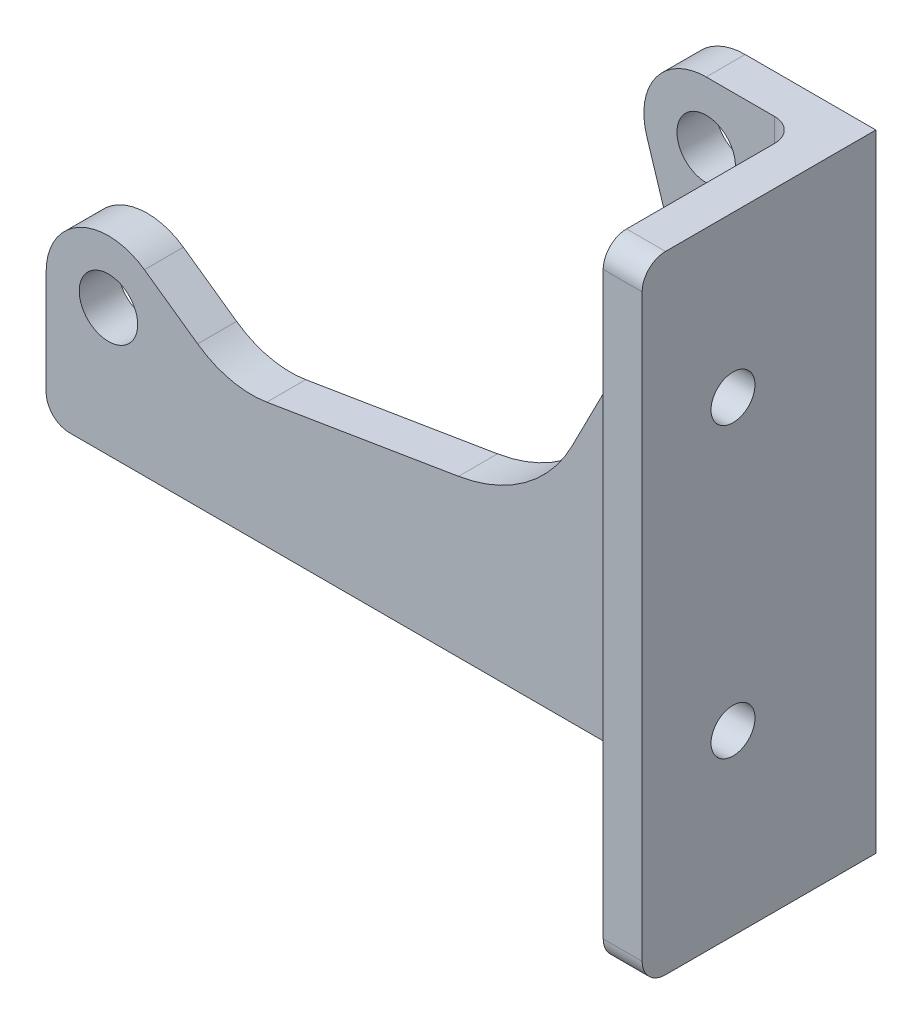
ISO-10303-21;
HEADER;
FILE_DESCRIPTION(('STEP AP214'),'2;1');
FILE_NAME('part.step','',(''),(''),'','','');
FILE_SCHEMA(('AUTOMOTIVE_DESIGN { 1 0 10303 214 1 1 1 1 }'));
ENDSEC;
DATA;
#1=APPLICATION_CONTEXT('core data for automotive mechanical design processes');
#2=APPLICATION_PROTOCOL_DEFINITION('international standard','automotive_design',2000,#1);
#3=PRODUCT_CONTEXT('',#1,'mechanical');
#4=PRODUCT('Part','Part','',(#3));
#5=PRODUCT_RELATED_PRODUCT_CATEGORY('part','',(#4));
#6=PRODUCT_DEFINITION_FORMATION('','',#4);
#7=PRODUCT_DEFINITION_CONTEXT('part definition',#1,'design');
#8=PRODUCT_DEFINITION('design','',#6,#7);
#9=PRODUCT_DEFINITION_SHAPE('','',#8);
#10=(LENGTH_UNIT() NAMED_UNIT(*) SI_UNIT(.MILLI.,.METRE.));
#11=(NAMED_UNIT(*) PLANE_ANGLE_UNIT() SI_UNIT($,.RADIAN.));
#12=(NAMED_UNIT(*) SI_UNIT($,.STERADIAN.) SOLID_ANGLE_UNIT());
#13=UNCERTAINTY_MEASURE_WITH_UNIT(LENGTH_MEASURE(1.E-05),#10,'distance_accuracy_value','');
#14=(GEOMETRIC_REPRESENTATION_CONTEXT(3) GLOBAL_UNCERTAINTY_ASSIGNED_CONTEXT((#13)) GLOBAL_UNIT_ASSIGNED_CONTEXT((#10,
#11,#12)) REPRESENTATION_CONTEXT('',''));
#15=CARTESIAN_POINT('',(0.,0.,0.));
#16=DIRECTION('',(0.,0.,1.));
#17=DIRECTION('',(1.,0.,0.));
#18=AXIS2_PLACEMENT_3D('',#15,#16,#17);
#19=CARTESIAN_POINT('',(0.,0.,6.35));
#20=DIRECTION('',(0.,0.,-1.));
#21=DIRECTION('',(-1.,0.,0.));
#22=AXIS2_PLACEMENT_3D('',#19,#20,#21);
#23=PLANE('',#22);
#24=CARTESIAN_POINT('',(216.357605160255,91.9733247746422,6.35));
#25=DIRECTION('',(0.,0.,-1.));
#26=DIRECTION('',(-1.,0.,0.));
#27=AXIS2_PLACEMENT_3D('',#24,#25,#26);
#28=CIRCLE('',#27,4.76249999997941);
#29=CARTESIAN_POINT('',(211.595105160275,91.9733247746422,6.35));
#30=VERTEX_POINT('',#29);
#31=EDGE_CURVE('E203',#30,#30,#28,.T.);
#32=ORIENTED_EDGE('',*,*,#31,.T.);
#33=EDGE_LOOP('',(#32));
#34=FACE_BOUND('',#33,.T.);
#35=CARTESIAN_POINT('',(118.91249749284,20.8335082744262,6.35));
#36=DIRECTION('',(0.,0.,-1.));
#37=DIRECTION('',(1.,0.,0.));
#38=AXIS2_PLACEMENT_3D('',#35,#36,#37);
#39=CIRCLE('',#38,4.76249999997942);
#40=CARTESIAN_POINT('',(123.674997492819,20.8335082744262,6.35));
#41=VERTEX_POINT('',#40);
#42=EDGE_CURVE('E308',#41,#41,#39,.T.);
#43=ORIENTED_EDGE('',*,*,#42,.T.);
#44=EDGE_LOOP('',(#43));
#45=FACE_BOUND('',#44,.T.);
#46=DIRECTION('',(0.,-1.,0.));
#47=VECTOR('',#46,1.);
#48=CARTESIAN_POINT('',(108.75249749284,20.8335082744262,6.35));
#49=LINE('',#48,#47);
#50=CARTESIAN_POINT('',(108.752497492848,20.8335082744262,6.35));
#51=VERTEX_POINT('',#50);
#52=CARTESIAN_POINT('',(108.75249749284,3.81,6.35));
#53=VERTEX_POINT('',#52);
#54=EDGE_CURVE('E218',#51,#53,#49,.T.);
#55=ORIENTED_EDGE('',*,*,#54,.T.);
#56=CARTESIAN_POINT('',(112.56249749284,3.81,6.35));
#57=DIRECTION('',(0.,0.,-1.));
#58=DIRECTION('',(-1.,0.,0.));
#59=AXIS2_PLACEMENT_3D('',#56,#57,#58);
#60=CIRCLE('',#59,3.81);
#61=CARTESIAN_POINT('',(112.56249749284,0.,6.35));
#62=VERTEX_POINT('',#61);
#63=EDGE_CURVE('E276',#53,#62,#60,.F.);
#64=ORIENTED_EDGE('',*,*,#63,.T.);
#65=DIRECTION('',(1.,0.,0.));
#66=VECTOR('',#65,1.);
#67=CARTESIAN_POINT('',(0.,0.,6.35));
#68=LINE('',#67,#66);
#69=CARTESIAN_POINT('',(227.506601653752,0.,6.35));
#70=VERTEX_POINT('',#69);
#71=EDGE_CURVE('E245',#62,#70,#68,.T.);
#72=ORIENTED_EDGE('',*,*,#71,.T.);
#73=DIRECTION('',(0.,-1.,0.));
#74=VECTOR('',#73,1.);
#75=CARTESIAN_POINT('',(227.506601653752,102.13254705538,6.35));
#76=LINE('',#75,#74);
#77=CARTESIAN_POINT('',(227.506601653752,102.132745141039,6.35));
#78=VERTEX_POINT('',#77);
#79=EDGE_CURVE('E277',#70,#78,#76,.F.);
#80=ORIENTED_EDGE('',*,*,#79,.T.);
#81=DIRECTION('',(-0.999999998648469,5.19909864822466E-05,0.));
#82=VECTOR('',#81,1.);
#83=CARTESIAN_POINT('',(237.666601653752,102.132216912616,6.35));
#84=LINE('',#83,#82);
#85=CARTESIAN_POINT('',(216.358133388677,102.133324760903,6.35));
#86=VERTEX_POINT('',#85);
#87=EDGE_CURVE('E216',#78,#86,#84,.T.);
#88=ORIENTED_EDGE('',*,*,#87,.T.);
#89=CARTESIAN_POINT('',(216.357605160255,91.9733247746422,6.35));
#90=DIRECTION('',(0.,0.,1.));
#91=DIRECTION('',(1.,0.,0.));
#92=AXIS2_PLACEMENT_3D('',#89,#90,#91);
#93=CIRCLE('',#92,10.1599999999881);
#94=CARTESIAN_POINT('',(206.66821837821,88.9169570304559,6.35));
#95=VERTEX_POINT('',#94);
#96=EDGE_CURVE('E214',#86,#95,#93,.T.);
#97=ORIENTED_EDGE('',*,*,#96,.T.);
#98=DIRECTION('',(0.300823596868778,-0.953679801383531,0.));
#99=VECTOR('',#98,1.);
#100=CARTESIAN_POINT('',(206.668218378214,88.9169570304571,6.35));
#101=LINE('',#100,#99);
#102=CARTESIAN_POINT('',(209.86365257402,78.7866976993721,6.35));
#103=VERTEX_POINT('',#102);
#104=EDGE_CURVE('E208',#95,#103,#101,.T.);
#105=ORIENTED_EDGE('',*,*,#104,.T.);
#106=CARTESIAN_POINT('',(195.329572400953,74.2021460830975,6.35));
#107=DIRECTION('',(0.,0.,-1.));
#108=DIRECTION('',(1.,0.,0.));
#109=AXIS2_PLACEMENT_3D('',#106,#107,#108);
#110=CIRCLE('',#109,15.2399999999924);
#111=CARTESIAN_POINT('',(208.895904566196,67.2586432507824,6.35));
#112=VERTEX_POINT('',#111);
#113=EDGE_CURVE('E181',#103,#112,#110,.T.);
#114=ORIENTED_EDGE('',*,*,#113,.T.);
#115=DIRECTION('',(-0.455610422066128,-0.890179275935317,0.));
#116=VECTOR('',#115,1.);
#117=CARTESIAN_POINT('',(208.895904566196,67.2586432507824,6.35));
#118=LINE('',#117,#116);
#119=CARTESIAN_POINT('',(194.461394124829,39.0562549144761,6.35));
#120=VERTEX_POINT('',#119);
#121=EDGE_CURVE('E232',#112,#120,#118,.T.);
#122=ORIENTED_EDGE('',*,*,#121,.T.);
#123=CARTESIAN_POINT('',(171.850840516072,50.6287596349558,6.35));
#124=DIRECTION('',(0.,0.,-1.));
#125=DIRECTION('',(1.,0.,0.));
#126=AXIS2_PLACEMENT_3D('',#123,#124,#125);
#127=CIRCLE('',#126,25.3999999999923);
#128=CARTESIAN_POINT('',(175.984822795608,25.567431048624,6.35));
#129=VERTEX_POINT('',#128);
#130=EDGE_CURVE('E235',#120,#129,#127,.T.);
#131=ORIENTED_EDGE('',*,*,#130,.T.);
#132=DIRECTION('',(-0.986666479777256,-0.1627552078551,0.));
#133=VECTOR('',#132,1.);
#134=CARTESIAN_POINT('',(144.725556293492,20.4110701898963,6.35));
#135=LINE('',#134,#133);
#136=CARTESIAN_POINT('',(144.725556293492,20.4110701898963,6.35));
#137=VERTEX_POINT('',#136);
#138=EDGE_CURVE('E230',#129,#137,#135,.T.);
#139=ORIENTED_EDGE('',*,*,#138,.T.);
#140=CARTESIAN_POINT('',(142.245166925759,35.4478673417011,6.35));
#141=DIRECTION('',(0.,0.,-1.));
#142=DIRECTION('',(1.,0.,0.));
#143=AXIS2_PLACEMENT_3D('',#140,#141,#142);
#144=CIRCLE('',#143,15.2399999999924);
#145=CARTESIAN_POINT('',(133.450682208598,23.0013964137874,6.35));
#146=VERTEX_POINT('',#145);
#147=EDGE_CURVE('E228',#137,#146,#144,.T.);
#148=ORIENTED_EDGE('',*,*,#147,.T.);
#149=DIRECTION('',(-0.816697567448816,0.577065926323143,0.));
#150=VECTOR('',#149,1.);
#151=CARTESIAN_POINT('',(124.775487304277,29.1311555596913,6.35));
#152=LINE('',#151,#150);
#153=CARTESIAN_POINT('',(124.775487304277,29.1311555596913,6.35));
#154=VERTEX_POINT('',#153);
#155=EDGE_CURVE('E225',#146,#154,#152,.T.);
#156=ORIENTED_EDGE('',*,*,#155,.T.);
#157=CARTESIAN_POINT('',(118.91249749284,20.8335082744262,6.35));
#158=DIRECTION('',(0.,0.,1.));
#159=DIRECTION('',(-1.,0.,0.));
#160=AXIS2_PLACEMENT_3D('',#157,#158,#159);
#161=CIRCLE('',#160,10.1599999999921);
#162=EDGE_CURVE('E219',#154,#51,#161,.T.);
#163=ORIENTED_EDGE('',*,*,#162,.T.);
#164=EDGE_LOOP('',(#55,#64,#72,#80,#88,#97,#105,#114,#122,#131,#139,#148,#156,#163));
#165=FACE_BOUND('',#164,.T.);
#166=ADVANCED_FACE('F43',(#34,#45,#165),#23,.F.);
#167=CARTESIAN_POINT('',(0.,0.,6.35));
#168=DIRECTION('',(0.,1.,0.));
#169=DIRECTION('',(0.,0.,1.));
#170=AXIS2_PLACEMENT_3D('',#167,#168,#169);
#171=PLANE('',#170);
#172=DIRECTION('',(0.,0.,-1.));
#173=VECTOR('',#172,1.);
#174=CARTESIAN_POINT('',(237.666601653752,0.,6.35));
#175=LINE('',#174,#173);
#176=CARTESIAN_POINT('',(237.666601653752,0.,34.29));
#177=VERTEX_POINT('',#176);
#178=CARTESIAN_POINT('',(237.666601653752,0.,0.));
#179=VERTEX_POINT('',#178);
#180=EDGE_CURVE('E244',#177,#179,#175,.T.);
#181=ORIENTED_EDGE('',*,*,#180,.F.);
#182=DIRECTION('',(1.,0.,0.));
#183=VECTOR('',#182,1.);
#184=CARTESIAN_POINT('',(231.316601653752,0.,34.29));
#185=LINE('',#184,#183);
#186=CARTESIAN_POINT('',(231.316601653752,0.,34.29));
#187=VERTEX_POINT('',#186);
#188=EDGE_CURVE('E274',#177,#187,#185,.F.);
#189=ORIENTED_EDGE('',*,*,#188,.T.);
#190=DIRECTION('',(0.,0.,-1.));
#191=VECTOR('',#190,1.);
#192=CARTESIAN_POINT('',(231.316601653752,0.,38.1));
#193=LINE('',#192,#191);
#194=CARTESIAN_POINT('',(231.316601653752,0.,10.16));
#195=VERTEX_POINT('',#194);
#196=EDGE_CURVE('E290',#187,#195,#193,.T.);
#197=ORIENTED_EDGE('',*,*,#196,.T.);
#198=CARTESIAN_POINT('',(227.506601653752,0.,10.16));
#199=DIRECTION('',(0.,1.,0.));
#200=DIRECTION('',(0.,0.,1.));
#201=AXIS2_PLACEMENT_3D('',#198,#199,#200);
#202=CIRCLE('',#201,3.81);
#203=EDGE_CURVE('E51',#195,#70,#202,.T.);
#204=ORIENTED_EDGE('',*,*,#203,.T.);
#205=ORIENTED_EDGE('',*,*,#71,.F.);
#206=DIRECTION('',(0.,0.,-1.));
#207=VECTOR('',#206,1.);
#208=CARTESIAN_POINT('',(112.56249749284,0.,6.35));
#209=LINE('',#208,#207);
#210=CARTESIAN_POINT('',(112.56249749284,0.,0.));
#211=VERTEX_POINT('',#210);
#212=EDGE_CURVE('E272',#62,#211,#209,.T.);
#213=ORIENTED_EDGE('',*,*,#212,.T.);
#214=DIRECTION('',(1.,0.,0.));
#215=VECTOR('',#214,1.);
#216=CARTESIAN_POINT('',(0.,0.,0.));
#217=LINE('',#216,#215);
#218=EDGE_CURVE('E239',#211,#179,#217,.T.);
#219=ORIENTED_EDGE('',*,*,#218,.T.);
#220=EDGE_LOOP('',(#181,#189,#197,#204,#205,#213,#219));
#221=FACE_BOUND('',#220,.T.);
#222=ADVANCED_FACE('F284',(#221),#171,.F.);
#223=CARTESIAN_POINT('',(237.666601653752,0.,6.35));
#224=DIRECTION('',(-1.,0.,0.));
#225=DIRECTION('',(0.,0.,1.));
#226=AXIS2_PLACEMENT_3D('',#223,#224,#225);
#227=PLANE('',#226);
#228=CARTESIAN_POINT('',(237.666601653752,76.0306449401721,23.2890629987538));
#229=DIRECTION('',(-1.,0.,0.));
#230=DIRECTION('',(0.,0.,1.));
#231=AXIS2_PLACEMENT_3D('',#228,#229,#230);
#232=CIRCLE('',#231,3.5814);
#233=CARTESIAN_POINT('',(237.666601653752,76.0306449401721,26.8704629987538));
#234=VERTEX_POINT('',#233);
#235=EDGE_CURVE('E424',#234,#234,#232,.T.);
#236=ORIENTED_EDGE('',*,*,#235,.T.);
#237=EDGE_LOOP('',(#236));
#238=FACE_BOUND('',#237,.T.);
#239=CARTESIAN_POINT('',(237.666601653752,28.9822631420205,23.2890629987538));
#240=DIRECTION('',(-1.,0.,0.));
#241=DIRECTION('',(0.,0.,1.));
#242=AXIS2_PLACEMENT_3D('',#239,#240,#241);
#243=CIRCLE('',#242,3.5814);
#244=CARTESIAN_POINT('',(237.666601653752,28.9822631420205,26.8704629987538));
#245=VERTEX_POINT('',#244);
#246=EDGE_CURVE('E427',#245,#245,#243,.T.);
#247=ORIENTED_EDGE('',*,*,#246,.T.);
#248=EDGE_LOOP('',(#247));
#249=FACE_BOUND('',#248,.T.);
#250=DIRECTION('',(0.,0.,-1.));
#251=VECTOR('',#250,1.);
#252=CARTESIAN_POINT('',(237.666601653752,102.132216912616,6.35));
#253=LINE('',#252,#251);
#254=CARTESIAN_POINT('',(237.666601653752,102.132216912616,34.29));
#255=VERTEX_POINT('',#254);
#256=CARTESIAN_POINT('',(237.666601653752,102.132216912616,0.));
#257=VERTEX_POINT('',#256);
#258=EDGE_CURVE('E331',#255,#257,#253,.T.);
#259=ORIENTED_EDGE('',*,*,#258,.F.);
#260=CARTESIAN_POINT('',(237.666601653752,98.3222169074663,34.29));
#261=DIRECTION('',(-1.,0.,0.));
#262=DIRECTION('',(0.,-1.,0.));
#263=AXIS2_PLACEMENT_3D('',#260,#261,#262);
#264=ELLIPSE('',#263,3.81000000514933,3.81);
#265=CARTESIAN_POINT('',(237.666601653752,98.3222169074663,38.1));
#266=VERTEX_POINT('',#265);
#267=EDGE_CURVE('E268',#255,#266,#264,.F.);
#268=ORIENTED_EDGE('',*,*,#267,.T.);
#269=DIRECTION('',(0.,1.,0.));
#270=VECTOR('',#269,1.);
#271=CARTESIAN_POINT('',(237.666601653752,102.132216912616,38.1));
#272=LINE('',#271,#270);
#273=CARTESIAN_POINT('',(237.666601653752,3.80999999999999,38.1));
#274=VERTEX_POINT('',#273);
#275=EDGE_CURVE('E306',#274,#266,#272,.T.);
#276=ORIENTED_EDGE('',*,*,#275,.F.);
#277=CARTESIAN_POINT('',(237.666601653752,3.81,34.29));
#278=DIRECTION('',(-1.,0.,0.));
#279=DIRECTION('',(0.,0.,1.));
#280=AXIS2_PLACEMENT_3D('',#277,#278,#279);
#281=CIRCLE('',#280,3.81);
#282=EDGE_CURVE('E266',#274,#177,#281,.F.);
#283=ORIENTED_EDGE('',*,*,#282,.T.);
#284=ORIENTED_EDGE('',*,*,#180,.T.);
#285=DIRECTION('',(0.,1.,0.));
#286=VECTOR('',#285,1.);
#287=CARTESIAN_POINT('',(237.666601653752,0.,0.));
#288=LINE('',#287,#286);
#289=EDGE_CURVE('E246',#179,#257,#288,.T.);
#290=ORIENTED_EDGE('',*,*,#289,.T.);
#291=EDGE_LOOP('',(#259,#268,#276,#283,#284,#290));
#292=FACE_BOUND('',#291,.T.);
#293=ADVANCED_FACE('F389',(#238,#249,#292),#227,.F.);
#294=CARTESIAN_POINT('',(0.,0.,0.));
#295=DIRECTION('',(0.,0.,-1.));
#296=DIRECTION('',(-1.,0.,0.));
#297=AXIS2_PLACEMENT_3D('',#294,#295,#296);
#298=PLANE('',#297);
#299=ORIENTED_EDGE('',*,*,#218,.F.);
#300=CARTESIAN_POINT('',(112.56249749284,3.81,0.));
#301=DIRECTION('',(0.,0.,-1.));
#302=DIRECTION('',(-1.,0.,0.));
#303=AXIS2_PLACEMENT_3D('',#300,#301,#302);
#304=CIRCLE('',#303,3.81);
#305=CARTESIAN_POINT('',(108.75249749284,3.81,0.));
#306=VERTEX_POINT('',#305);
#307=EDGE_CURVE('E66',#211,#306,#304,.T.);
#308=ORIENTED_EDGE('',*,*,#307,.T.);
#309=DIRECTION('',(0.,-1.,0.));
#310=VECTOR('',#309,1.);
#311=CARTESIAN_POINT('',(108.75249749284,20.8335082744262,0.));
#312=LINE('',#311,#310);
#313=CARTESIAN_POINT('',(108.752497492848,20.8335082744262,0.));
#314=VERTEX_POINT('',#313);
#315=EDGE_CURVE('E343',#314,#306,#312,.T.);
#316=ORIENTED_EDGE('',*,*,#315,.F.);
#317=CARTESIAN_POINT('',(118.91249749284,20.8335082744262,0.));
#318=DIRECTION('',(0.,0.,1.));
#319=DIRECTION('',(-1.,0.,0.));
#320=AXIS2_PLACEMENT_3D('',#317,#318,#319);
#321=CIRCLE('',#320,10.1599999999921);
#322=CARTESIAN_POINT('',(124.775487304277,29.1311555596913,0.));
#323=VERTEX_POINT('',#322);
#324=EDGE_CURVE('E342',#323,#314,#321,.T.);
#325=ORIENTED_EDGE('',*,*,#324,.F.);
#326=DIRECTION('',(-0.816697567448816,0.577065926323143,0.));
#327=VECTOR('',#326,1.);
#328=CARTESIAN_POINT('',(124.775487304277,29.1311555596913,0.));
#329=LINE('',#328,#327);
#330=CARTESIAN_POINT('',(133.450682208598,23.0013964137874,0.));
#331=VERTEX_POINT('',#330);
#332=EDGE_CURVE('E346',#331,#323,#329,.T.);
#333=ORIENTED_EDGE('',*,*,#332,.F.);
#334=CARTESIAN_POINT('',(142.245166925759,35.4478673417011,0.));
#335=DIRECTION('',(0.,0.,-1.));
#336=DIRECTION('',(1.,0.,0.));
#337=AXIS2_PLACEMENT_3D('',#334,#335,#336);
#338=CIRCLE('',#337,15.2399999999924);
#339=CARTESIAN_POINT('',(144.725556293492,20.4110701898963,0.));
#340=VERTEX_POINT('',#339);
#341=EDGE_CURVE('E347',#340,#331,#338,.T.);
#342=ORIENTED_EDGE('',*,*,#341,.F.);
#343=DIRECTION('',(-0.986666479777256,-0.1627552078551,0.));
#344=VECTOR('',#343,1.);
#345=CARTESIAN_POINT('',(144.725556293492,20.4110701898963,0.));
#346=LINE('',#345,#344);
#347=CARTESIAN_POINT('',(175.984822795608,25.567431048624,0.));
#348=VERTEX_POINT('',#347);
#349=EDGE_CURVE('E351',#348,#340,#346,.T.);
#350=ORIENTED_EDGE('',*,*,#349,.F.);
#351=CARTESIAN_POINT('',(171.850840516072,50.6287596349558,0.));
#352=DIRECTION('',(0.,0.,-1.));
#353=DIRECTION('',(1.,0.,0.));
#354=AXIS2_PLACEMENT_3D('',#351,#352,#353);
#355=CIRCLE('',#354,25.3999999999923);
#356=CARTESIAN_POINT('',(194.461394124829,39.0562549144761,0.));
#357=VERTEX_POINT('',#356);
#358=EDGE_CURVE('E207',#357,#348,#355,.T.);
#359=ORIENTED_EDGE('',*,*,#358,.F.);
#360=DIRECTION('',(-0.455610422066128,-0.890179275935317,0.));
#361=VECTOR('',#360,1.);
#362=CARTESIAN_POINT('',(208.895904566196,67.2586432507824,0.));
#363=LINE('',#362,#361);
#364=CARTESIAN_POINT('',(208.895904566196,67.2586432507824,0.));
#365=VERTEX_POINT('',#364);
#366=EDGE_CURVE('E199',#365,#357,#363,.T.);
#367=ORIENTED_EDGE('',*,*,#366,.F.);
#368=CARTESIAN_POINT('',(195.329572400953,74.2021460830975,0.));
#369=DIRECTION('',(0.,0.,-1.));
#370=DIRECTION('',(1.,0.,0.));
#371=AXIS2_PLACEMENT_3D('',#368,#369,#370);
#372=CIRCLE('',#371,15.2399999999924);
#373=CARTESIAN_POINT('',(209.86365257402,78.7866976993721,0.));
#374=VERTEX_POINT('',#373);
#375=EDGE_CURVE('E178',#374,#365,#372,.T.);
#376=ORIENTED_EDGE('',*,*,#375,.F.);
#377=DIRECTION('',(0.300823596868778,-0.953679801383531,0.));
#378=VECTOR('',#377,1.);
#379=CARTESIAN_POINT('',(206.668218378214,88.9169570304571,0.));
#380=LINE('',#379,#378);
#381=CARTESIAN_POINT('',(206.66821837821,88.9169570304559,0.));
#382=VERTEX_POINT('',#381);
#383=EDGE_CURVE('E186',#382,#374,#380,.T.);
#384=ORIENTED_EDGE('',*,*,#383,.F.);
#385=CARTESIAN_POINT('',(216.357605160255,91.9733247746422,0.));
#386=DIRECTION('',(0.,0.,1.));
#387=DIRECTION('',(1.,0.,0.));
#388=AXIS2_PLACEMENT_3D('',#385,#386,#387);
#389=CIRCLE('',#388,10.1599999999881);
#390=CARTESIAN_POINT('',(216.358133388677,102.133324760903,0.));
#391=VERTEX_POINT('',#390);
#392=EDGE_CURVE('E192',#391,#382,#389,.T.);
#393=ORIENTED_EDGE('',*,*,#392,.F.);
#394=DIRECTION('',(-0.999999998648469,5.19909864822466E-05,0.));
#395=VECTOR('',#394,1.);
#396=CARTESIAN_POINT('',(237.666601653752,102.132216912616,0.));
#397=LINE('',#396,#395);
#398=EDGE_CURVE('E336',#257,#391,#397,.T.);
#399=ORIENTED_EDGE('',*,*,#398,.F.);
#400=ORIENTED_EDGE('',*,*,#289,.F.);
#401=EDGE_LOOP('',(#299,#308,#316,#325,#333,#342,#350,#359,#367,#376,#384,#393,#399,#400));
#402=FACE_BOUND('',#401,.T.);
#403=CARTESIAN_POINT('',(118.91249749284,20.8335082744262,0.));
#404=DIRECTION('',(0.,0.,-1.));
#405=DIRECTION('',(1.,0.,0.));
#406=AXIS2_PLACEMENT_3D('',#403,#404,#405);
#407=CIRCLE('',#406,4.76249999997942);
#408=CARTESIAN_POINT('',(123.674997492819,20.8335082744262,0.));
#409=VERTEX_POINT('',#408);
#410=EDGE_CURVE('E187',#409,#409,#407,.T.);
#411=ORIENTED_EDGE('',*,*,#410,.F.);
#412=EDGE_LOOP('',(#411));
#413=FACE_BOUND('',#412,.T.);
#414=CARTESIAN_POINT('',(216.357605160255,91.9733247746422,0.));
#415=DIRECTION('',(0.,0.,-1.));
#416=DIRECTION('',(-1.,0.,0.));
#417=AXIS2_PLACEMENT_3D('',#414,#415,#416);
#418=CIRCLE('',#417,4.76249999997941);
#419=CARTESIAN_POINT('',(211.595105160275,91.9733247746422,0.));
#420=VERTEX_POINT('',#419);
#421=EDGE_CURVE('E204',#420,#420,#418,.T.);
#422=ORIENTED_EDGE('',*,*,#421,.F.);
#423=EDGE_LOOP('',(#422));
#424=FACE_BOUND('',#423,.T.);
#425=ADVANCED_FACE('F196',(#402,#413,#424),#298,.T.);
#426=CARTESIAN_POINT('',(216.357605160255,91.9733247746422,6.35));
#427=DIRECTION('',(0.,0.,-1.));
#428=DIRECTION('',(-1.,0.,0.));
#429=AXIS2_PLACEMENT_3D('',#426,#427,#428);
#430=CYLINDRICAL_SURFACE('',#429,4.76249999997941);
#431=ORIENTED_EDGE('',*,*,#31,.F.);
#432=EDGE_LOOP('',(#431));
#433=FACE_BOUND('',#432,.T.);
#434=ORIENTED_EDGE('',*,*,#421,.T.);
#435=EDGE_LOOP('',(#434));
#436=FACE_BOUND('',#435,.T.);
#437=ADVANCED_FACE('F395',(#433,#436),#430,.F.);
#438=CARTESIAN_POINT('',(118.91249749284,20.8335082744262,6.35));
#439=DIRECTION('',(0.,0.,-1.));
#440=DIRECTION('',(-1.,0.,0.));
#441=AXIS2_PLACEMENT_3D('',#438,#439,#440);
#442=CYLINDRICAL_SURFACE('',#441,4.76249999997942);
#443=ORIENTED_EDGE('',*,*,#42,.F.);
#444=EDGE_LOOP('',(#443));
#445=FACE_BOUND('',#444,.T.);
#446=ORIENTED_EDGE('',*,*,#410,.T.);
#447=EDGE_LOOP('',(#446));
#448=FACE_BOUND('',#447,.T.);
#449=ADVANCED_FACE('F452',(#445,#448),#442,.F.);
#450=CARTESIAN_POINT('',(195.329572400953,74.2021460830975,6.35));
#451=DIRECTION('',(0.,0.,-1.));
#452=DIRECTION('',(-1.,0.,0.));
#453=AXIS2_PLACEMENT_3D('',#450,#451,#452);
#454=CYLINDRICAL_SURFACE('',#453,15.2399999999924);
#455=ORIENTED_EDGE('',*,*,#375,.T.);
#456=DIRECTION('',(0.,0.,-1.));
#457=VECTOR('',#456,1.);
#458=CARTESIAN_POINT('',(208.895904566196,67.2586432507824,6.35));
#459=LINE('',#458,#457);
#460=EDGE_CURVE('E212',#112,#365,#459,.T.);
#461=ORIENTED_EDGE('',*,*,#460,.F.);
#462=ORIENTED_EDGE('',*,*,#113,.F.);
#463=DIRECTION('',(0.,0.,-1.));
#464=VECTOR('',#463,1.);
#465=CARTESIAN_POINT('',(209.86365257402,78.7866976993721,6.35));
#466=LINE('',#465,#464);
#467=EDGE_CURVE('E172',#103,#374,#466,.T.);
#468=ORIENTED_EDGE('',*,*,#467,.T.);
#469=EDGE_LOOP('',(#455,#461,#462,#468));
#470=FACE_BOUND('',#469,.T.);
#471=ADVANCED_FACE('F176',(#470),#454,.F.);
#472=CARTESIAN_POINT('',(206.668218378214,88.9169570304571,6.35));
#473=DIRECTION('',(0.953679801383531,0.300823596868778,0.));
#474=DIRECTION('',(-0.300823596868778,0.953679801383531,0.));
#475=AXIS2_PLACEMENT_3D('',#472,#473,#474);
#476=PLANE('',#475);
#477=ORIENTED_EDGE('',*,*,#383,.T.);
#478=ORIENTED_EDGE('',*,*,#467,.F.);
#479=ORIENTED_EDGE('',*,*,#104,.F.);
#480=DIRECTION('',(0.,0.,-1.));
#481=VECTOR('',#480,1.);
#482=CARTESIAN_POINT('',(206.66821837821,88.9169570304559,6.35));
#483=LINE('',#482,#481);
#484=EDGE_CURVE('E184',#95,#382,#483,.T.);
#485=ORIENTED_EDGE('',*,*,#484,.T.);
#486=EDGE_LOOP('',(#477,#478,#479,#485));
#487=FACE_BOUND('',#486,.T.);
#488=ADVANCED_FACE('F188',(#487),#476,.F.);
#489=CARTESIAN_POINT('',(216.357605160255,91.9733247746422,6.35));
#490=DIRECTION('',(0.,0.,-1.));
#491=DIRECTION('',(-1.,0.,0.));
#492=AXIS2_PLACEMENT_3D('',#489,#490,#491);
#493=CYLINDRICAL_SURFACE('',#492,10.1599999999881);
#494=ORIENTED_EDGE('',*,*,#392,.T.);
#495=ORIENTED_EDGE('',*,*,#484,.F.);
#496=ORIENTED_EDGE('',*,*,#96,.F.);
#497=DIRECTION('',(0.,0.,-1.));
#498=VECTOR('',#497,1.);
#499=CARTESIAN_POINT('',(216.358133388677,102.133324760903,6.35));
#500=LINE('',#499,#498);
#501=EDGE_CURVE('E333',#86,#391,#500,.T.);
#502=ORIENTED_EDGE('',*,*,#501,.T.);
#503=EDGE_LOOP('',(#494,#495,#496,#502));
#504=FACE_BOUND('',#503,.T.);
#505=ADVANCED_FACE('F459',(#504),#493,.T.);
#506=CARTESIAN_POINT('',(237.666601653752,102.132216912616,6.35));
#507=DIRECTION('',(-5.19909864822466E-05,-0.999999998648469,0.));
#508=DIRECTION('',(0.999999998648469,-5.19909864822466E-05,0.));
#509=AXIS2_PLACEMENT_3D('',#506,#507,#508);
#510=PLANE('',#509);
#511=DIRECTION('',(0.,0.,-1.));
#512=VECTOR('',#511,1.);
#513=CARTESIAN_POINT('',(231.316601653752,102.13254705538,38.1));
#514=LINE('',#513,#512);
#515=CARTESIAN_POINT('',(231.316601653752,102.13254705538,34.29));
#516=VERTEX_POINT('',#515);
#517=CARTESIAN_POINT('',(231.316601653752,102.13254705538,10.16));
#518=VERTEX_POINT('',#517);
#519=EDGE_CURVE('E297',#516,#518,#514,.T.);
#520=ORIENTED_EDGE('',*,*,#519,.F.);
#521=DIRECTION('',(-0.999999998648469,5.19909864822466E-05,0.));
#522=VECTOR('',#521,1.);
#523=CARTESIAN_POINT('',(237.666601653752,102.132216912616,34.29));
#524=LINE('',#523,#522);
#525=EDGE_CURVE('E264',#516,#255,#524,.F.);
#526=ORIENTED_EDGE('',*,*,#525,.T.);
#527=ORIENTED_EDGE('',*,*,#258,.T.);
#528=ORIENTED_EDGE('',*,*,#398,.T.);
#529=ORIENTED_EDGE('',*,*,#501,.F.);
#530=ORIENTED_EDGE('',*,*,#87,.F.);
#531=CARTESIAN_POINT('',(227.506601653752,102.132745141039,10.16));
#532=DIRECTION('',(-5.19909864822466E-05,-0.999999998648469,0.));
#533=DIRECTION('',(-0.999999998648469,5.19909864822466E-05,0.));
#534=AXIS2_PLACEMENT_3D('',#531,#532,#533);
#535=ELLIPSE('',#534,3.81000000514933,3.81);
#536=EDGE_CURVE('E11',#78,#518,#535,.T.);
#537=ORIENTED_EDGE('',*,*,#536,.T.);
#538=EDGE_LOOP('',(#520,#526,#527,#528,#529,#530,#537));
#539=FACE_BOUND('',#538,.T.);
#540=ADVANCED_FACE('F299',(#539),#510,.F.);
#541=CARTESIAN_POINT('',(108.75249749284,20.8335082744262,6.35));
#542=DIRECTION('',(1.,0.,0.));
#543=DIRECTION('',(0.,1.,0.));
#544=AXIS2_PLACEMENT_3D('',#541,#542,#543);
#545=PLANE('',#544);
#546=ORIENTED_EDGE('',*,*,#315,.T.);
#547=DIRECTION('',(0.,0.,-1.));
#548=VECTOR('',#547,1.);
#549=CARTESIAN_POINT('',(108.75249749284,3.81,6.35));
#550=LINE('',#549,#548);
#551=EDGE_CURVE('E59',#306,#53,#550,.F.);
#552=ORIENTED_EDGE('',*,*,#551,.T.);
#553=ORIENTED_EDGE('',*,*,#54,.F.);
#554=DIRECTION('',(0.,0.,-1.));
#555=VECTOR('',#554,1.);
#556=CARTESIAN_POINT('',(108.752497492848,20.8335082744262,6.35));
#557=LINE('',#556,#555);
#558=EDGE_CURVE('E329',#51,#314,#557,.T.);
#559=ORIENTED_EDGE('',*,*,#558,.T.);
#560=EDGE_LOOP('',(#546,#552,#553,#559));
#561=FACE_BOUND('',#560,.T.);
#562=ADVANCED_FACE('F469',(#561),#545,.F.);
#563=CARTESIAN_POINT('',(118.91249749284,20.8335082744262,6.35));
#564=DIRECTION('',(0.,0.,-1.));
#565=DIRECTION('',(-1.,0.,0.));
#566=AXIS2_PLACEMENT_3D('',#563,#564,#565);
#567=CYLINDRICAL_SURFACE('',#566,10.1599999999921);
#568=ORIENTED_EDGE('',*,*,#324,.T.);
#569=ORIENTED_EDGE('',*,*,#558,.F.);
#570=ORIENTED_EDGE('',*,*,#162,.F.);
#571=DIRECTION('',(0.,0.,-1.));
#572=VECTOR('',#571,1.);
#573=CARTESIAN_POINT('',(124.775487304277,29.1311555596913,6.35));
#574=LINE('',#573,#572);
#575=EDGE_CURVE('E328',#154,#323,#574,.T.);
#576=ORIENTED_EDGE('',*,*,#575,.T.);
#577=EDGE_LOOP('',(#568,#569,#570,#576));
#578=FACE_BOUND('',#577,.T.);
#579=ADVANCED_FACE('F474',(#578),#567,.T.);
#580=CARTESIAN_POINT('',(124.775487304277,29.1311555596913,6.35));
#581=DIRECTION('',(-0.577065926323143,-0.816697567448816,0.));
#582=DIRECTION('',(0.816697567448816,-0.577065926323143,0.));
#583=AXIS2_PLACEMENT_3D('',#580,#581,#582);
#584=PLANE('',#583);
#585=ORIENTED_EDGE('',*,*,#332,.T.);
#586=ORIENTED_EDGE('',*,*,#575,.F.);
#587=ORIENTED_EDGE('',*,*,#155,.F.);
#588=DIRECTION('',(0.,0.,-1.));
#589=VECTOR('',#588,1.);
#590=CARTESIAN_POINT('',(133.450682208598,23.0013964137874,6.35));
#591=LINE('',#590,#589);
#592=EDGE_CURVE('E326',#146,#331,#591,.T.);
#593=ORIENTED_EDGE('',*,*,#592,.T.);
#594=EDGE_LOOP('',(#585,#586,#587,#593));
#595=FACE_BOUND('',#594,.T.);
#596=ADVANCED_FACE('F471',(#595),#584,.F.);
#597=CARTESIAN_POINT('',(142.245166925759,35.4478673417011,6.35));
#598=DIRECTION('',(0.,0.,-1.));
#599=DIRECTION('',(-1.,0.,0.));
#600=AXIS2_PLACEMENT_3D('',#597,#598,#599);
#601=CYLINDRICAL_SURFACE('',#600,15.2399999999924);
#602=ORIENTED_EDGE('',*,*,#341,.T.);
#603=ORIENTED_EDGE('',*,*,#592,.F.);
#604=ORIENTED_EDGE('',*,*,#147,.F.);
#605=DIRECTION('',(0.,0.,-1.));
#606=VECTOR('',#605,1.);
#607=CARTESIAN_POINT('',(144.725556293492,20.4110701898963,6.35));
#608=LINE('',#607,#606);
#609=EDGE_CURVE('E325',#137,#340,#608,.T.);
#610=ORIENTED_EDGE('',*,*,#609,.T.);
#611=EDGE_LOOP('',(#602,#603,#604,#610));
#612=FACE_BOUND('',#611,.T.);
#613=ADVANCED_FACE('F477',(#612),#601,.F.);
#614=CARTESIAN_POINT('',(144.725556293492,20.4110701898963,6.35));
#615=DIRECTION('',(0.1627552078551,-0.986666479777256,0.));
#616=DIRECTION('',(0.986666479777257,0.1627552078551,0.));
#617=AXIS2_PLACEMENT_3D('',#614,#615,#616);
#618=PLANE('',#617);
#619=ORIENTED_EDGE('',*,*,#349,.T.);
#620=ORIENTED_EDGE('',*,*,#609,.F.);
#621=ORIENTED_EDGE('',*,*,#138,.F.);
#622=DIRECTION('',(0.,0.,-1.));
#623=VECTOR('',#622,1.);
#624=CARTESIAN_POINT('',(175.984822795608,25.567431048624,6.35));
#625=LINE('',#624,#623);
#626=EDGE_CURVE('E324',#129,#348,#625,.T.);
#627=ORIENTED_EDGE('',*,*,#626,.T.);
#628=EDGE_LOOP('',(#619,#620,#621,#627));
#629=FACE_BOUND('',#628,.T.);
#630=ADVANCED_FACE('F361',(#629),#618,.F.);
#631=CARTESIAN_POINT('',(171.850840516072,50.6287596349558,6.35));
#632=DIRECTION('',(0.,0.,-1.));
#633=DIRECTION('',(-1.,0.,0.));
#634=AXIS2_PLACEMENT_3D('',#631,#632,#633);
#635=CYLINDRICAL_SURFACE('',#634,25.3999999999923);
#636=ORIENTED_EDGE('',*,*,#358,.T.);
#637=ORIENTED_EDGE('',*,*,#626,.F.);
#638=ORIENTED_EDGE('',*,*,#130,.F.);
#639=DIRECTION('',(0.,0.,-1.));
#640=VECTOR('',#639,1.);
#641=CARTESIAN_POINT('',(194.461394124829,39.0562549144761,6.35));
#642=LINE('',#641,#640);
#643=EDGE_CURVE('E318',#120,#357,#642,.T.);
#644=ORIENTED_EDGE('',*,*,#643,.T.);
#645=EDGE_LOOP('',(#636,#637,#638,#644));
#646=FACE_BOUND('',#645,.T.);
#647=ADVANCED_FACE('F357',(#646),#635,.F.);
#648=CARTESIAN_POINT('',(208.895904566196,67.2586432507824,6.35));
#649=DIRECTION('',(0.890179275935317,-0.455610422066128,0.));
#650=DIRECTION('',(0.455610422066128,0.890179275935317,0.));
#651=AXIS2_PLACEMENT_3D('',#648,#649,#650);
#652=PLANE('',#651);
#653=ORIENTED_EDGE('',*,*,#366,.T.);
#654=ORIENTED_EDGE('',*,*,#643,.F.);
#655=ORIENTED_EDGE('',*,*,#121,.F.);
#656=ORIENTED_EDGE('',*,*,#460,.T.);
#657=EDGE_LOOP('',(#653,#654,#655,#656));
#658=FACE_BOUND('',#657,.T.);
#659=ADVANCED_FACE('F370',(#658),#652,.F.);
#660=CARTESIAN_POINT('',(231.316601653752,102.13254705538,38.1));
#661=DIRECTION('',(1.,0.,0.));
#662=DIRECTION('',(0.,0.,-1.));
#663=AXIS2_PLACEMENT_3D('',#660,#661,#662);
#664=PLANE('',#663);
#665=CARTESIAN_POINT('',(231.316601653752,76.0306449401721,23.2890629987538));
#666=DIRECTION('',(-1.,0.,0.));
#667=DIRECTION('',(0.,0.,1.));
#668=AXIS2_PLACEMENT_3D('',#665,#666,#667);
#669=CIRCLE('',#668,3.5814);
#670=CARTESIAN_POINT('',(231.316601653752,76.0306449401721,26.8704629987538));
#671=VERTEX_POINT('',#670);
#672=EDGE_CURVE('E430',#671,#671,#669,.T.);
#673=ORIENTED_EDGE('',*,*,#672,.F.);
#674=EDGE_LOOP('',(#673));
#675=FACE_BOUND('',#674,.T.);
#676=CARTESIAN_POINT('',(231.316601653752,28.9822631420205,23.2890629987538));
#677=DIRECTION('',(-1.,0.,0.));
#678=DIRECTION('',(0.,0.,1.));
#679=AXIS2_PLACEMENT_3D('',#676,#677,#678);
#680=CIRCLE('',#679,3.5814);
#681=CARTESIAN_POINT('',(231.316601653752,28.9822631420205,26.8704629987538));
#682=VERTEX_POINT('',#681);
#683=EDGE_CURVE('E433',#682,#682,#680,.T.);
#684=ORIENTED_EDGE('',*,*,#683,.F.);
#685=EDGE_LOOP('',(#684));
#686=FACE_BOUND('',#685,.T.);
#687=DIRECTION('',(0.,-1.,0.));
#688=VECTOR('',#687,1.);
#689=CARTESIAN_POINT('',(231.316601653752,102.13254705538,38.1));
#690=LINE('',#689,#688);
#691=CARTESIAN_POINT('',(231.316601653752,98.3225470502309,38.1));
#692=VERTEX_POINT('',#691);
#693=CARTESIAN_POINT('',(231.316601653752,3.81000000000002,38.1));
#694=VERTEX_POINT('',#693);
#695=EDGE_CURVE('E311',#692,#694,#690,.T.);
#696=ORIENTED_EDGE('',*,*,#695,.F.);
#697=CARTESIAN_POINT('',(231.316601653752,98.3225470502309,34.29));
#698=DIRECTION('',(1.,0.,0.));
#699=DIRECTION('',(0.,-1.,0.));
#700=AXIS2_PLACEMENT_3D('',#697,#698,#699);
#701=ELLIPSE('',#700,3.81000000514933,3.81);
#702=EDGE_CURVE('E263',#692,#516,#701,.F.);
#703=ORIENTED_EDGE('',*,*,#702,.T.);
#704=ORIENTED_EDGE('',*,*,#519,.T.);
#705=DIRECTION('',(0.,-1.,0.));
#706=VECTOR('',#705,1.);
#707=CARTESIAN_POINT('',(231.316601653752,0.,10.16));
#708=LINE('',#707,#706);
#709=EDGE_CURVE('E257',#518,#195,#708,.T.);
#710=ORIENTED_EDGE('',*,*,#709,.T.);
#711=ORIENTED_EDGE('',*,*,#196,.F.);
#712=CARTESIAN_POINT('',(231.316601653752,3.81,34.29));
#713=DIRECTION('',(1.,0.,0.));
#714=DIRECTION('',(0.,0.,-1.));
#715=AXIS2_PLACEMENT_3D('',#712,#713,#714);
#716=CIRCLE('',#715,3.81);
#717=EDGE_CURVE('E261',#187,#694,#716,.F.);
#718=ORIENTED_EDGE('',*,*,#717,.T.);
#719=EDGE_LOOP('',(#696,#703,#704,#710,#711,#718));
#720=FACE_BOUND('',#719,.T.);
#721=ADVANCED_FACE('F304',(#675,#686,#720),#664,.F.);
#722=CARTESIAN_POINT('',(0.,0.,38.1));
#723=DIRECTION('',(0.,0.,1.));
#724=DIRECTION('',(1.,0.,0.));
#725=AXIS2_PLACEMENT_3D('',#722,#723,#724);
#726=PLANE('',#725);
#727=ORIENTED_EDGE('',*,*,#275,.T.);
#728=DIRECTION('',(-0.999999998648469,5.19909864822466E-05,0.));
#729=VECTOR('',#728,1.);
#730=CARTESIAN_POINT('',(231.316403568093,98.3225470605296,38.1));
#731=LINE('',#730,#729);
#732=EDGE_CURVE('E253',#266,#692,#731,.T.);
#733=ORIENTED_EDGE('',*,*,#732,.T.);
#734=ORIENTED_EDGE('',*,*,#695,.T.);
#735=DIRECTION('',(1.,0.,0.));
#736=VECTOR('',#735,1.);
#737=CARTESIAN_POINT('',(237.666601653752,3.81,38.1));
#738=LINE('',#737,#736);
#739=EDGE_CURVE('E255',#694,#274,#738,.T.);
#740=ORIENTED_EDGE('',*,*,#739,.T.);
#741=EDGE_LOOP('',(#727,#733,#734,#740));
#742=FACE_BOUND('',#741,.T.);
#743=ADVANCED_FACE('F374',(#742),#726,.T.);
#744=CARTESIAN_POINT('',(237.666601653752,28.9822631420205,23.2890629987538));
#745=DIRECTION('',(-1.,0.,0.));
#746=DIRECTION('',(0.,0.,1.));
#747=AXIS2_PLACEMENT_3D('',#744,#745,#746);
#748=CYLINDRICAL_SURFACE('',#747,3.5814);
#749=CARTESIAN_POINT('',(237.666601653752,28.9822631420205,26.8704629987538));
#750=CARTESIAN_POINT('',(237.600455820418,28.9822631420205,26.8704629987538));
#751=CARTESIAN_POINT('',(237.534309987085,28.9822631420205,26.8704629987538));
#752=CARTESIAN_POINT('',(237.402018320418,28.9822631420205,26.8704629987538));
#753=CARTESIAN_POINT('',(237.335872487085,28.9822631420205,26.8704629987538));
#754=CARTESIAN_POINT('',(237.203580820418,28.9822631420205,26.8704629987538));
#755=CARTESIAN_POINT('',(237.137434987085,28.9822631420205,26.8704629987538));
#756=CARTESIAN_POINT('',(237.005143320418,28.9822631420205,26.8704629987538));
#757=CARTESIAN_POINT('',(236.938997487085,28.9822631420205,26.8704629987538));
#758=CARTESIAN_POINT('',(236.806705820418,28.9822631420205,26.8704629987538));
#759=CARTESIAN_POINT('',(236.740559987085,28.9822631420205,26.8704629987538));
#760=CARTESIAN_POINT('',(236.608268320418,28.9822631420205,26.8704629987538));
#761=CARTESIAN_POINT('',(236.542122487085,28.9822631420205,26.8704629987538));
#762=CARTESIAN_POINT('',(236.409830820418,28.9822631420205,26.8704629987538));
#763=CARTESIAN_POINT('',(236.343684987085,28.9822631420205,26.8704629987538));
#764=CARTESIAN_POINT('',(236.211393320418,28.9822631420205,26.8704629987538));
#765=CARTESIAN_POINT('',(236.145247487085,28.9822631420205,26.8704629987538));
#766=CARTESIAN_POINT('',(236.012955820418,28.9822631420205,26.8704629987538));
#767=CARTESIAN_POINT('',(235.946809987085,28.9822631420205,26.8704629987538));
#768=CARTESIAN_POINT('',(235.814518320418,28.9822631420205,26.8704629987538));
#769=CARTESIAN_POINT('',(235.748372487085,28.9822631420205,26.8704629987538));
#770=CARTESIAN_POINT('',(235.616080820418,28.9822631420205,26.8704629987538));
#771=CARTESIAN_POINT('',(235.549934987085,28.9822631420205,26.8704629987538));
#772=CARTESIAN_POINT('',(235.417643320418,28.9822631420205,26.8704629987538));
#773=CARTESIAN_POINT('',(235.351497487085,28.9822631420205,26.8704629987538));
#774=CARTESIAN_POINT('',(235.219205820418,28.9822631420205,26.8704629987538));
#775=CARTESIAN_POINT('',(235.153059987085,28.9822631420205,26.8704629987538));
#776=CARTESIAN_POINT('',(235.020768320418,28.9822631420205,26.8704629987538));
#777=CARTESIAN_POINT('',(234.954622487085,28.9822631420205,26.8704629987538));
#778=CARTESIAN_POINT('',(234.822330820418,28.9822631420205,26.8704629987538));
#779=CARTESIAN_POINT('',(234.756184987085,28.9822631420205,26.8704629987538));
#780=CARTESIAN_POINT('',(234.623893320418,28.9822631420205,26.8704629987538));
#781=CARTESIAN_POINT('',(234.557747487085,28.9822631420205,26.8704629987538));
#782=CARTESIAN_POINT('',(234.425455820418,28.9822631420205,26.8704629987538));
#783=CARTESIAN_POINT('',(234.359309987085,28.9822631420205,26.8704629987538));
#784=CARTESIAN_POINT('',(234.227018320418,28.9822631420205,26.8704629987538));
#785=CARTESIAN_POINT('',(234.160872487085,28.9822631420205,26.8704629987538));
#786=CARTESIAN_POINT('',(234.028580820418,28.9822631420205,26.8704629987538));
#787=CARTESIAN_POINT('',(233.962434987085,28.9822631420205,26.8704629987538));
#788=CARTESIAN_POINT('',(233.830143320418,28.9822631420205,26.8704629987538));
#789=CARTESIAN_POINT('',(233.763997487085,28.9822631420205,26.8704629987538));
#790=CARTESIAN_POINT('',(233.631705820418,28.9822631420205,26.8704629987538));
#791=CARTESIAN_POINT('',(233.565559987085,28.9822631420205,26.8704629987538));
#792=CARTESIAN_POINT('',(233.433268320418,28.9822631420205,26.8704629987538));
#793=CARTESIAN_POINT('',(233.367122487085,28.9822631420205,26.8704629987538));
#794=CARTESIAN_POINT('',(233.234830820418,28.9822631420205,26.8704629987538));
#795=CARTESIAN_POINT('',(233.168684987085,28.9822631420205,26.8704629987538));
#796=CARTESIAN_POINT('',(233.036393320418,28.9822631420205,26.8704629987538));
#797=CARTESIAN_POINT('',(232.970247487085,28.9822631420205,26.8704629987538));
#798=CARTESIAN_POINT('',(232.837955820418,28.9822631420205,26.8704629987538));
#799=CARTESIAN_POINT('',(232.771809987085,28.9822631420205,26.8704629987538));
#800=CARTESIAN_POINT('',(232.639518320418,28.9822631420205,26.8704629987538));
#801=CARTESIAN_POINT('',(232.573372487085,28.9822631420205,26.8704629987538));
#802=CARTESIAN_POINT('',(232.441080820418,28.9822631420205,26.8704629987538));
#803=CARTESIAN_POINT('',(232.374934987085,28.9822631420205,26.8704629987538));
#804=CARTESIAN_POINT('',(232.242643320418,28.9822631420205,26.8704629987538));
#805=CARTESIAN_POINT('',(232.176497487085,28.9822631420205,26.8704629987538));
#806=CARTESIAN_POINT('',(232.044205820418,28.9822631420205,26.8704629987538));
#807=CARTESIAN_POINT('',(231.978059987085,28.9822631420205,26.8704629987538));
#808=CARTESIAN_POINT('',(231.845768320418,28.9822631420205,26.8704629987538));
#809=CARTESIAN_POINT('',(231.779622487085,28.9822631420205,26.8704629987538));
#810=CARTESIAN_POINT('',(231.647330820418,28.9822631420205,26.8704629987538));
#811=CARTESIAN_POINT('',(231.581184987085,28.9822631420205,26.8704629987538));
#812=CARTESIAN_POINT('',(231.448893320418,28.9822631420205,26.8704629987538));
#813=CARTESIAN_POINT('',(231.382747487085,28.9822631420205,26.8704629987538));
#814=CARTESIAN_POINT('',(231.316601653752,28.9822631420205,26.8704629987538));
#815=B_SPLINE_CURVE_WITH_KNOTS('',3,(#749,#750,#751,#752,#753,#754,#755,#756,#757,#758,#759,
#760,#761,#762,#763,#764,#765,#766,#767,#768,#769,#770,#771,#772,#773,#774,#775,#776,#777,#778,
#779,#780,#781,#782,#783,#784,#785,#786,#787,#788,#789,#790,#791,#792,#793,#794,#795,#796,#797,
#798,#799,#800,#801,#802,#803,#804,#805,#806,#807,#808,#809,#810,#811,#812,#813,#814),
.UNSPECIFIED.,.F.,.F.,(4,2,2,2,2,2,2,2,2,2,2,2,2,2,2,2,2,2,2,2,2,2,2,2,2,2,2,2,2,2,2,2,4),(0.,
0.198437500000009,0.396875000000019,0.595312500000028,0.79375000000001,0.992187500000019,
1.19062500000003,1.38906250000001,1.58750000000002,1.78593750000003,1.98437500000001,
2.18281250000002,2.38125000000003,2.57968750000001,2.77812500000002,2.97656250000003,
3.17500000000001,3.37343750000002,3.57187500000003,3.77031250000004,3.96875000000002,
4.16718750000003,4.36562500000004,4.56406250000002,4.76250000000003,4.96093750000004,
5.15937500000002,5.35781250000003,5.55625000000004,5.75468750000002,5.95312500000003,
6.15156250000004,6.35000000000002),.UNSPECIFIED.);
#816=EDGE_CURVE('BSEAM445',#245,#682,#815,.T.);
#817=ORIENTED_EDGE('',*,*,#246,.F.);
#818=ORIENTED_EDGE('',*,*,#683,.T.);
#819=ORIENTED_EDGE('',*,*,#816,.T.);
#820=ORIENTED_EDGE('',*,*,#816,.F.);
#821=EDGE_LOOP('',(#817,#819,#818,#820));
#822=FACE_BOUND('',#821,.T.);
#823=ADVANCED_FACE('F445',(#822),#748,.F.);
#824=CARTESIAN_POINT('',(237.666601653752,76.0306449401721,23.2890629987538));
#825=DIRECTION('',(-1.,0.,0.));
#826=DIRECTION('',(0.,0.,1.));
#827=AXIS2_PLACEMENT_3D('',#824,#825,#826);
#828=CYLINDRICAL_SURFACE('',#827,3.5814);
#829=CARTESIAN_POINT('',(237.666601653752,76.0306449401721,26.8704629987538));
#830=CARTESIAN_POINT('',(237.600455820418,76.0306449401721,26.8704629987538));
#831=CARTESIAN_POINT('',(237.534309987085,76.0306449401721,26.8704629987538));
#832=CARTESIAN_POINT('',(237.402018320418,76.0306449401721,26.8704629987538));
#833=CARTESIAN_POINT('',(237.335872487085,76.0306449401721,26.8704629987538));
#834=CARTESIAN_POINT('',(237.203580820418,76.0306449401721,26.8704629987538));
#835=CARTESIAN_POINT('',(237.137434987085,76.0306449401721,26.8704629987538));
#836=CARTESIAN_POINT('',(237.005143320418,76.0306449401721,26.8704629987538));
#837=CARTESIAN_POINT('',(236.938997487085,76.0306449401721,26.8704629987538));
#838=CARTESIAN_POINT('',(236.806705820418,76.0306449401721,26.8704629987538));
#839=CARTESIAN_POINT('',(236.740559987085,76.0306449401721,26.8704629987538));
#840=CARTESIAN_POINT('',(236.608268320418,76.0306449401721,26.8704629987538));
#841=CARTESIAN_POINT('',(236.542122487085,76.0306449401721,26.8704629987538));
#842=CARTESIAN_POINT('',(236.409830820418,76.0306449401721,26.8704629987538));
#843=CARTESIAN_POINT('',(236.343684987085,76.0306449401721,26.8704629987538));
#844=CARTESIAN_POINT('',(236.211393320418,76.0306449401721,26.8704629987538));
#845=CARTESIAN_POINT('',(236.145247487085,76.0306449401721,26.8704629987538));
#846=CARTESIAN_POINT('',(236.012955820418,76.0306449401721,26.8704629987538));
#847=CARTESIAN_POINT('',(235.946809987085,76.0306449401721,26.8704629987538));
#848=CARTESIAN_POINT('',(235.814518320418,76.0306449401721,26.8704629987538));
#849=CARTESIAN_POINT('',(235.748372487085,76.0306449401721,26.8704629987538));
#850=CARTESIAN_POINT('',(235.616080820418,76.0306449401721,26.8704629987538));
#851=CARTESIAN_POINT('',(235.549934987085,76.0306449401721,26.8704629987538));
#852=CARTESIAN_POINT('',(235.417643320418,76.0306449401721,26.8704629987538));
#853=CARTESIAN_POINT('',(235.351497487085,76.0306449401721,26.8704629987538));
#854=CARTESIAN_POINT('',(235.219205820418,76.0306449401721,26.8704629987538));
#855=CARTESIAN_POINT('',(235.153059987085,76.0306449401721,26.8704629987538));
#856=CARTESIAN_POINT('',(235.020768320418,76.0306449401721,26.8704629987538));
#857=CARTESIAN_POINT('',(234.954622487085,76.0306449401721,26.8704629987538));
#858=CARTESIAN_POINT('',(234.822330820418,76.0306449401721,26.8704629987538));
#859=CARTESIAN_POINT('',(234.756184987085,76.0306449401721,26.8704629987538));
#860=CARTESIAN_POINT('',(234.623893320418,76.0306449401721,26.8704629987538));
#861=CARTESIAN_POINT('',(234.557747487085,76.0306449401721,26.8704629987538));
#862=CARTESIAN_POINT('',(234.425455820418,76.0306449401721,26.8704629987538));
#863=CARTESIAN_POINT('',(234.359309987085,76.0306449401721,26.8704629987538));
#864=CARTESIAN_POINT('',(234.227018320418,76.0306449401721,26.8704629987538));
#865=CARTESIAN_POINT('',(234.160872487085,76.0306449401721,26.8704629987538));
#866=CARTESIAN_POINT('',(234.028580820418,76.0306449401721,26.8704629987538));
#867=CARTESIAN_POINT('',(233.962434987085,76.0306449401721,26.8704629987538));
#868=CARTESIAN_POINT('',(233.830143320418,76.0306449401721,26.8704629987538));
#869=CARTESIAN_POINT('',(233.763997487085,76.0306449401721,26.8704629987538));
#870=CARTESIAN_POINT('',(233.631705820418,76.0306449401721,26.8704629987538));
#871=CARTESIAN_POINT('',(233.565559987085,76.0306449401721,26.8704629987538));
#872=CARTESIAN_POINT('',(233.433268320418,76.0306449401721,26.8704629987538));
#873=CARTESIAN_POINT('',(233.367122487085,76.0306449401721,26.8704629987538));
#874=CARTESIAN_POINT('',(233.234830820418,76.0306449401721,26.8704629987538));
#875=CARTESIAN_POINT('',(233.168684987085,76.0306449401721,26.8704629987538));
#876=CARTESIAN_POINT('',(233.036393320418,76.0306449401721,26.8704629987538));
#877=CARTESIAN_POINT('',(232.970247487085,76.0306449401721,26.8704629987538));
#878=CARTESIAN_POINT('',(232.837955820418,76.0306449401721,26.8704629987538));
#879=CARTESIAN_POINT('',(232.771809987085,76.0306449401721,26.8704629987538));
#880=CARTESIAN_POINT('',(232.639518320418,76.0306449401721,26.8704629987538));
#881=CARTESIAN_POINT('',(232.573372487085,76.0306449401721,26.8704629987538));
#882=CARTESIAN_POINT('',(232.441080820418,76.0306449401721,26.8704629987538));
#883=CARTESIAN_POINT('',(232.374934987085,76.0306449401721,26.8704629987538));
#884=CARTESIAN_POINT('',(232.242643320418,76.0306449401721,26.8704629987538));
#885=CARTESIAN_POINT('',(232.176497487085,76.0306449401721,26.8704629987538));
#886=CARTESIAN_POINT('',(232.044205820418,76.0306449401721,26.8704629987538));
#887=CARTESIAN_POINT('',(231.978059987085,76.0306449401721,26.8704629987538));
#888=CARTESIAN_POINT('',(231.845768320418,76.0306449401721,26.8704629987538));
#889=CARTESIAN_POINT('',(231.779622487085,76.0306449401721,26.8704629987538));
#890=CARTESIAN_POINT('',(231.647330820418,76.0306449401721,26.8704629987538));
#891=CARTESIAN_POINT('',(231.581184987085,76.0306449401721,26.8704629987538));
#892=CARTESIAN_POINT('',(231.448893320418,76.0306449401721,26.8704629987538));
#893=CARTESIAN_POINT('',(231.382747487085,76.0306449401721,26.8704629987538));
#894=CARTESIAN_POINT('',(231.316601653752,76.0306449401721,26.8704629987538));
#895=B_SPLINE_CURVE_WITH_KNOTS('',3,(#829,#830,#831,#832,#833,#834,#835,#836,#837,#838,#839,
#840,#841,#842,#843,#844,#845,#846,#847,#848,#849,#850,#851,#852,#853,#854,#855,#856,#857,#858,
#859,#860,#861,#862,#863,#864,#865,#866,#867,#868,#869,#870,#871,#872,#873,#874,#875,#876,#877,
#878,#879,#880,#881,#882,#883,#884,#885,#886,#887,#888,#889,#890,#891,#892,#893,#894),
.UNSPECIFIED.,.F.,.F.,(4,2,2,2,2,2,2,2,2,2,2,2,2,2,2,2,2,2,2,2,2,2,2,2,2,2,2,2,2,2,2,2,4),(0.,
0.198437500000009,0.396875000000019,0.595312500000028,0.79375000000001,0.992187500000019,
1.19062500000003,1.38906250000001,1.58750000000002,1.78593750000003,1.98437500000001,
2.18281250000002,2.38125000000003,2.57968750000001,2.77812500000002,2.97656250000003,
3.17500000000001,3.37343750000002,3.57187500000003,3.77031250000004,3.96875000000002,
4.16718750000003,4.36562500000004,4.56406250000002,4.76250000000003,4.96093750000004,
5.15937500000002,5.35781250000003,5.55625000000004,5.75468750000002,5.95312500000003,
6.15156250000004,6.35000000000002),.UNSPECIFIED.);
#896=EDGE_CURVE('BSEAM401',#234,#671,#895,.T.);
#897=ORIENTED_EDGE('',*,*,#235,.F.);
#898=ORIENTED_EDGE('',*,*,#672,.T.);
#899=ORIENTED_EDGE('',*,*,#896,.T.);
#900=ORIENTED_EDGE('',*,*,#896,.F.);
#901=EDGE_LOOP('',(#897,#899,#898,#900));
#902=FACE_BOUND('',#901,.T.);
#903=ADVANCED_FACE('F401',(#902),#828,.F.);
#904=CARTESIAN_POINT('',(0.00511251147095186,98.3345731627523,34.29));
#905=DIRECTION('',(0.999999998648469,-5.19909864822466E-05,0.));
#906=DIRECTION('',(5.19909864822466E-05,0.999999998648469,0.));
#907=AXIS2_PLACEMENT_3D('',#904,#905,#906);
#908=CYLINDRICAL_SURFACE('',#907,3.81);
#909=ORIENTED_EDGE('',*,*,#267,.F.);
#910=ORIENTED_EDGE('',*,*,#525,.F.);
#911=ORIENTED_EDGE('',*,*,#702,.F.);
#912=ORIENTED_EDGE('',*,*,#732,.F.);
#913=EDGE_LOOP('',(#909,#910,#911,#912));
#914=FACE_BOUND('',#913,.T.);
#915=ADVANCED_FACE('F398',(#914),#908,.T.);
#916=CARTESIAN_POINT('',(0.,3.81,34.29));
#917=DIRECTION('',(-1.,0.,0.));
#918=DIRECTION('',(0.,0.,1.));
#919=AXIS2_PLACEMENT_3D('',#916,#917,#918);
#920=CYLINDRICAL_SURFACE('',#919,3.81);
#921=ORIENTED_EDGE('',*,*,#717,.F.);
#922=ORIENTED_EDGE('',*,*,#188,.F.);
#923=ORIENTED_EDGE('',*,*,#282,.F.);
#924=ORIENTED_EDGE('',*,*,#739,.F.);
#925=EDGE_LOOP('',(#921,#922,#923,#924));
#926=FACE_BOUND('',#925,.T.);
#927=ADVANCED_FACE('F405',(#926),#920,.T.);
#928=CARTESIAN_POINT('',(112.56249749284,3.81,6.35));
#929=DIRECTION('',(0.,0.,-1.));
#930=DIRECTION('',(-1.,0.,0.));
#931=AXIS2_PLACEMENT_3D('',#928,#929,#930);
#932=CYLINDRICAL_SURFACE('',#931,3.81);
#933=ORIENTED_EDGE('',*,*,#63,.F.);
#934=ORIENTED_EDGE('',*,*,#551,.F.);
#935=ORIENTED_EDGE('',*,*,#307,.F.);
#936=ORIENTED_EDGE('',*,*,#212,.F.);
#937=EDGE_LOOP('',(#933,#934,#935,#936));
#938=FACE_BOUND('',#937,.T.);
#939=ADVANCED_FACE('F408',(#938),#932,.T.);
#940=CARTESIAN_POINT('',(227.506601653752,102.13254705538,10.16));
#941=DIRECTION('',(0.,1.,0.));
#942=DIRECTION('',(0.,0.,1.));
#943=AXIS2_PLACEMENT_3D('',#940,#941,#942);
#944=CYLINDRICAL_SURFACE('',#943,3.81);
#945=ORIENTED_EDGE('',*,*,#536,.F.);
#946=ORIENTED_EDGE('',*,*,#79,.F.);
#947=ORIENTED_EDGE('',*,*,#203,.F.);
#948=ORIENTED_EDGE('',*,*,#709,.F.);
#949=EDGE_LOOP('',(#945,#946,#947,#948));
#950=FACE_BOUND('',#949,.T.);
#951=ADVANCED_FACE('F44',(#950),#944,.F.);
#952=CLOSED_SHELL('',(#166,#222,#293,#425,#437,#449,#471,#488,#505,#540,#562,#579,#596,#613,
#630,#647,#659,#721,#743,#823,#903,#915,#927,#939,#951));
#953=MANIFOLD_SOLID_BREP('B2',#952);
#954=ADVANCED_BREP_SHAPE_REPRESENTATION('',(#18,#953),#14);
#955=SHAPE_DEFINITION_REPRESENTATION(#9,#954);
ENDSEC;
END-ISO-10303-21;
